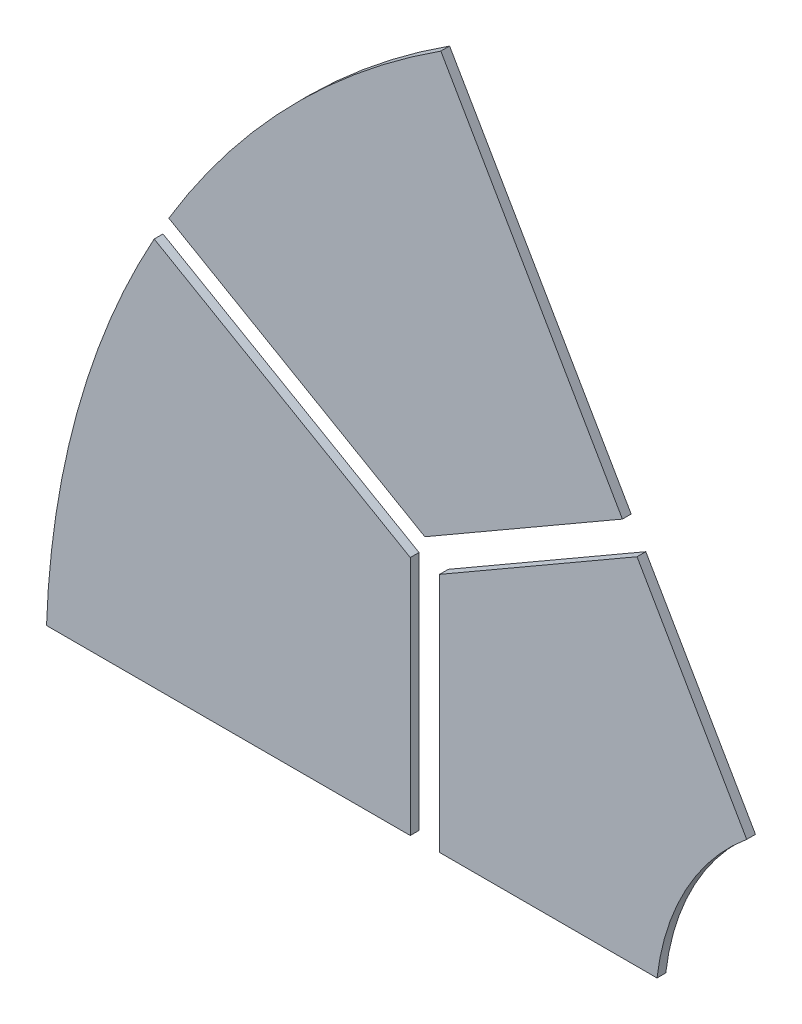
ISO-10303-21;
HEADER;
FILE_DESCRIPTION(('STEP AP214'),'2;1');
FILE_NAME('part.step','',(''),(''),'','','');
FILE_SCHEMA(('AUTOMOTIVE_DESIGN { 1 0 10303 214 1 1 1 1 }'));
ENDSEC;
DATA;
#1=APPLICATION_CONTEXT('core data for automotive mechanical design processes');
#2=APPLICATION_PROTOCOL_DEFINITION('international standard','automotive_design',2000,#1);
#3=PRODUCT_CONTEXT('',#1,'mechanical');
#4=PRODUCT('Part','Part','',(#3));
#5=PRODUCT_RELATED_PRODUCT_CATEGORY('part','',(#4));
#6=PRODUCT_DEFINITION_FORMATION('','',#4);
#7=PRODUCT_DEFINITION_CONTEXT('part definition',#1,'design');
#8=PRODUCT_DEFINITION('design','',#6,#7);
#9=PRODUCT_DEFINITION_SHAPE('','',#8);
#10=(LENGTH_UNIT() NAMED_UNIT(*) SI_UNIT(.MILLI.,.METRE.));
#11=(NAMED_UNIT(*) PLANE_ANGLE_UNIT() SI_UNIT($,.RADIAN.));
#12=(NAMED_UNIT(*) SI_UNIT($,.STERADIAN.) SOLID_ANGLE_UNIT());
#13=UNCERTAINTY_MEASURE_WITH_UNIT(LENGTH_MEASURE(1.E-05),#10,'distance_accuracy_value','');
#14=(GEOMETRIC_REPRESENTATION_CONTEXT(3) GLOBAL_UNCERTAINTY_ASSIGNED_CONTEXT((#13)) GLOBAL_UNIT_ASSIGNED_CONTEXT((#10,
#11,#12)) REPRESENTATION_CONTEXT('',''));
#15=CARTESIAN_POINT('',(0.,0.,0.));
#16=DIRECTION('',(0.,0.,1.));
#17=DIRECTION('',(1.,0.,0.));
#18=AXIS2_PLACEMENT_3D('',#15,#16,#17);
#19=CARTESIAN_POINT('',(0.,0.,6.));
#20=DIRECTION('',(0.,0.,-1.));
#21=DIRECTION('',(-1.,0.,0.));
#22=AXIS2_PLACEMENT_3D('',#19,#20,#21);
#23=CYLINDRICAL_SURFACE('',#22,172.4);
#24=CARTESIAN_POINT('',(0.,0.,0.));
#25=DIRECTION('',(0.,0.,1.));
#26=DIRECTION('',(1.,0.,0.));
#27=AXIS2_PLACEMENT_3D('',#24,#25,#26);
#28=CIRCLE('',#27,172.4);
#29=CARTESIAN_POINT('',(-109.821022542494,132.895082707078,0.));
#30=VERTEX_POINT('',#29);
#31=CARTESIAN_POINT('',(-171.235977528088,20.,0.));
#32=VERTEX_POINT('',#31);
#33=EDGE_CURVE('E174',#30,#32,#28,.T.);
#34=ORIENTED_EDGE('',*,*,#33,.F.);
#35=DIRECTION('',(0.,0.,-1.));
#36=VECTOR('',#35,1.);
#37=CARTESIAN_POINT('',(-109.821022542494,132.895082707078,6.));
#38=LINE('',#37,#36);
#39=CARTESIAN_POINT('',(-109.821022542494,132.895082707078,6.));
#40=VERTEX_POINT('',#39);
#41=EDGE_CURVE('E13',#40,#30,#38,.T.);
#42=ORIENTED_EDGE('',*,*,#41,.F.);
#43=CARTESIAN_POINT('',(0.,0.,6.));
#44=DIRECTION('',(0.,0.,1.));
#45=DIRECTION('',(1.,0.,0.));
#46=AXIS2_PLACEMENT_3D('',#43,#44,#45);
#47=CIRCLE('',#46,172.4);
#48=CARTESIAN_POINT('',(-171.235977528088,20.,6.));
#49=VERTEX_POINT('',#48);
#50=EDGE_CURVE('E185',#40,#49,#47,.T.);
#51=ORIENTED_EDGE('',*,*,#50,.T.);
#52=DIRECTION('',(0.,0.,-1.));
#53=VECTOR('',#52,1.);
#54=CARTESIAN_POINT('',(-171.235977528088,20.,6.));
#55=LINE('',#54,#53);
#56=EDGE_CURVE('E117',#49,#32,#55,.T.);
#57=ORIENTED_EDGE('',*,*,#56,.T.);
#58=EDGE_LOOP('',(#34,#42,#51,#57));
#59=FACE_BOUND('',#58,.T.);
#60=ADVANCED_FACE('F101',(#59),#23,.F.);
#61=CARTESIAN_POINT('',(-24.8205080756886,-14.3301270189221,6.));
#62=DIRECTION('',(-0.866025403784438,-0.5,0.));
#63=DIRECTION('',(0.5,-0.866025403784439,0.));
#64=AXIS2_PLACEMENT_3D('',#61,#62,#63);
#65=PLANE('',#64);
#66=DIRECTION('',(-0.5,0.866025403784439,0.));
#67=VECTOR('',#66,1.);
#68=CARTESIAN_POINT('',(-24.8205080756886,-14.3301270189221,0.));
#69=LINE('',#68,#67);
#70=CARTESIAN_POINT('',(-184.920508075688,262.971207272854,0.));
#71=VERTEX_POINT('',#70);
#72=EDGE_CURVE('E176',#30,#71,#69,.T.);
#73=ORIENTED_EDGE('',*,*,#72,.T.);
#74=DIRECTION('',(0.,0.,-1.));
#75=VECTOR('',#74,1.);
#76=CARTESIAN_POINT('',(-184.920508075688,262.971207272854,6.));
#77=LINE('',#76,#75);
#78=CARTESIAN_POINT('',(-184.920508075688,262.971207272854,6.));
#79=VERTEX_POINT('',#78);
#80=EDGE_CURVE('E109',#79,#71,#77,.T.);
#81=ORIENTED_EDGE('',*,*,#80,.F.);
#82=DIRECTION('',(-0.5,0.866025403784439,0.));
#83=VECTOR('',#82,1.);
#84=CARTESIAN_POINT('',(-24.8205080756886,-14.3301270189221,6.));
#85=LINE('',#84,#83);
#86=EDGE_CURVE('E165',#40,#79,#85,.T.);
#87=ORIENTED_EDGE('',*,*,#86,.F.);
#88=ORIENTED_EDGE('',*,*,#41,.T.);
#89=EDGE_LOOP('',(#73,#81,#87,#88));
#90=FACE_BOUND('',#89,.T.);
#91=ADVANCED_FACE('F189',(#90),#65,.F.);
#92=CARTESIAN_POINT('',(-160.099999999998,277.301334291777,6.));
#93=DIRECTION('',(-0.499999999999997,0.866025403784441,0.));
#94=DIRECTION('',(-0.866025403784441,-0.499999999999997,0.));
#95=AXIS2_PLACEMENT_3D('',#92,#93,#94);
#96=PLANE('',#95);
#97=DIRECTION('',(0.866025403784441,0.499999999999997,0.));
#98=VECTOR('',#97,1.);
#99=CARTESIAN_POINT('',(-160.099999999998,277.301334291777,0.));
#100=LINE('',#99,#98);
#101=CARTESIAN_POINT('',(-320.199999999999,184.867556194525,0.));
#102=VERTEX_POINT('',#101);
#103=EDGE_CURVE('E154',#102,#71,#100,.T.);
#104=ORIENTED_EDGE('',*,*,#103,.F.);
#105=DIRECTION('',(0.,0.,-1.));
#106=VECTOR('',#105,1.);
#107=CARTESIAN_POINT('',(-320.199999999999,184.867556194525,6.));
#108=LINE('',#107,#106);
#109=CARTESIAN_POINT('',(-320.199999999999,184.867556194525,6.));
#110=VERTEX_POINT('',#109);
#111=EDGE_CURVE('E149',#110,#102,#108,.T.);
#112=ORIENTED_EDGE('',*,*,#111,.F.);
#113=DIRECTION('',(0.866025403784441,0.499999999999997,0.));
#114=VECTOR('',#113,1.);
#115=CARTESIAN_POINT('',(-160.099999999998,277.301334291777,6.));
#116=LINE('',#115,#114);
#117=EDGE_CURVE('E152',#110,#79,#116,.T.);
#118=ORIENTED_EDGE('',*,*,#117,.T.);
#119=ORIENTED_EDGE('',*,*,#80,.T.);
#120=EDGE_LOOP('',(#104,#112,#118,#119));
#121=FACE_BOUND('',#120,.T.);
#122=ADVANCED_FACE('F151',(#121),#96,.T.);
#123=CARTESIAN_POINT('',(-320.199999999999,0.,6.));
#124=DIRECTION('',(-1.,0.,0.));
#125=DIRECTION('',(0.,0.,1.));
#126=AXIS2_PLACEMENT_3D('',#123,#124,#125);
#127=PLANE('',#126);
#128=DIRECTION('',(0.,1.,0.));
#129=VECTOR('',#128,1.);
#130=CARTESIAN_POINT('',(-320.199999999999,0.,0.));
#131=LINE('',#130,#129);
#132=CARTESIAN_POINT('',(-320.2,20.,0.));
#133=VERTEX_POINT('',#132);
#134=EDGE_CURVE('E180',#133,#102,#131,.T.);
#135=ORIENTED_EDGE('',*,*,#134,.F.);
#136=DIRECTION('',(0.,0.,-1.));
#137=VECTOR('',#136,1.);
#138=CARTESIAN_POINT('',(-320.2,20.,6.));
#139=LINE('',#138,#137);
#140=CARTESIAN_POINT('',(-320.2,20.,6.));
#141=VERTEX_POINT('',#140);
#142=EDGE_CURVE('E133',#141,#133,#139,.T.);
#143=ORIENTED_EDGE('',*,*,#142,.F.);
#144=DIRECTION('',(0.,1.,0.));
#145=VECTOR('',#144,1.);
#146=CARTESIAN_POINT('',(-320.199999999999,0.,6.));
#147=LINE('',#146,#145);
#148=EDGE_CURVE('E164',#141,#110,#147,.T.);
#149=ORIENTED_EDGE('',*,*,#148,.T.);
#150=ORIENTED_EDGE('',*,*,#111,.T.);
#151=EDGE_LOOP('',(#135,#143,#149,#150));
#152=FACE_BOUND('',#151,.T.);
#153=ADVANCED_FACE('F168',(#152),#127,.T.);
#154=CARTESIAN_POINT('',(0.,20.,6.));
#155=DIRECTION('',(0.,-1.,0.));
#156=DIRECTION('',(1.,0.,0.));
#157=AXIS2_PLACEMENT_3D('',#154,#155,#156);
#158=PLANE('',#157);
#159=DIRECTION('',(-1.,0.,0.));
#160=VECTOR('',#159,1.);
#161=CARTESIAN_POINT('',(0.,20.,0.));
#162=LINE('',#161,#160);
#163=EDGE_CURVE('E182',#32,#133,#162,.T.);
#164=ORIENTED_EDGE('',*,*,#163,.F.);
#165=ORIENTED_EDGE('',*,*,#56,.F.);
#166=DIRECTION('',(-1.,0.,0.));
#167=VECTOR('',#166,1.);
#168=CARTESIAN_POINT('',(0.,20.,6.));
#169=LINE('',#168,#167);
#170=EDGE_CURVE('E169',#49,#141,#169,.T.);
#171=ORIENTED_EDGE('',*,*,#170,.T.);
#172=ORIENTED_EDGE('',*,*,#142,.T.);
#173=EDGE_LOOP('',(#164,#165,#171,#172));
#174=FACE_BOUND('',#173,.T.);
#175=ADVANCED_FACE('F192',(#174),#158,.T.);
#176=CARTESIAN_POINT('',(0.,0.,6.));
#177=DIRECTION('',(0.,0.,1.));
#178=DIRECTION('',(1.,0.,0.));
#179=AXIS2_PLACEMENT_3D('',#176,#177,#178);
#180=PLANE('',#179);
#181=ORIENTED_EDGE('',*,*,#50,.F.);
#182=ORIENTED_EDGE('',*,*,#86,.T.);
#183=ORIENTED_EDGE('',*,*,#117,.F.);
#184=ORIENTED_EDGE('',*,*,#148,.F.);
#185=ORIENTED_EDGE('',*,*,#170,.F.);
#186=EDGE_LOOP('',(#181,#182,#183,#184,#185));
#187=FACE_BOUND('',#186,.T.);
#188=ADVANCED_FACE('F162',(#187),#180,.T.);
#189=CARTESIAN_POINT('',(0.,0.,0.));
#190=DIRECTION('',(0.,0.,1.));
#191=DIRECTION('',(1.,0.,0.));
#192=AXIS2_PLACEMENT_3D('',#189,#190,#191);
#193=PLANE('',#192);
#194=ORIENTED_EDGE('',*,*,#33,.T.);
#195=ORIENTED_EDGE('',*,*,#163,.T.);
#196=ORIENTED_EDGE('',*,*,#134,.T.);
#197=ORIENTED_EDGE('',*,*,#103,.T.);
#198=ORIENTED_EDGE('',*,*,#72,.F.);
#199=EDGE_LOOP('',(#194,#195,#196,#197,#198));
#200=FACE_BOUND('',#199,.T.);
#201=ADVANCED_FACE('F191',(#200),#193,.F.);
#202=CLOSED_SHELL('',(#60,#91,#122,#153,#175,#188,#201));
#203=MANIFOLD_SOLID_BREP('B2',#202);
#204=CARTESIAN_POINT('',(1.11022302462516E-13,0.,6.));
#205=DIRECTION('',(0.,0.,-1.));
#206=DIRECTION('',(-1.,0.,0.));
#207=AXIS2_PLACEMENT_3D('',#204,#205,#206);
#208=CYLINDRICAL_SURFACE('',#207,589.6);
#209=CARTESIAN_POINT('',(1.11022302462516E-13,0.,0.));
#210=DIRECTION('',(0.,0.,1.));
#211=DIRECTION('',(1.,0.,0.));
#212=AXIS2_PLACEMENT_3D('',#209,#210,#211);
#213=CIRCLE('',#212,589.6);
#214=CARTESIAN_POINT('',(-505.535131014502,303.417849359839,0.));
#215=VERTEX_POINT('',#214);
#216=CARTESIAN_POINT('',(-319.272010805122,495.674836073463,0.));
#217=VERTEX_POINT('',#216);
#218=EDGE_CURVE('E363',#215,#217,#213,.F.);
#219=ORIENTED_EDGE('',*,*,#218,.F.);
#220=DIRECTION('',(0.,0.,-1.));
#221=VECTOR('',#220,1.);
#222=CARTESIAN_POINT('',(-505.535131014502,303.417849359839,6.));
#223=LINE('',#222,#221);
#224=CARTESIAN_POINT('',(-505.535131014502,303.417849359839,6.));
#225=VERTEX_POINT('',#224);
#226=EDGE_CURVE('E99',#225,#215,#223,.T.);
#227=ORIENTED_EDGE('',*,*,#226,.F.);
#228=CARTESIAN_POINT('',(1.11022302462516E-13,0.,6.));
#229=DIRECTION('',(0.,0.,1.));
#230=DIRECTION('',(1.,0.,0.));
#231=AXIS2_PLACEMENT_3D('',#228,#229,#230);
#232=CIRCLE('',#231,589.6);
#233=CARTESIAN_POINT('',(-319.272010805122,495.674836073463,6.));
#234=VERTEX_POINT('',#233);
#235=EDGE_CURVE('E357',#225,#234,#232,.F.);
#236=ORIENTED_EDGE('',*,*,#235,.T.);
#237=DIRECTION('',(0.,0.,-1.));
#238=VECTOR('',#237,1.);
#239=CARTESIAN_POINT('',(-319.272010805122,495.674836073463,6.));
#240=LINE('',#239,#238);
#241=EDGE_CURVE('E338',#234,#217,#240,.T.);
#242=ORIENTED_EDGE('',*,*,#241,.T.);
#243=EDGE_LOOP('',(#219,#227,#236,#242));
#244=FACE_BOUND('',#243,.T.);
#245=ADVANCED_FACE('F300',(#244),#208,.T.);
#246=CARTESIAN_POINT('',(5.00000000000019,8.66025403784438,6.));
#247=DIRECTION('',(-0.500000000000014,-0.86602540378443,0.));
#248=DIRECTION('',(0.866025403784431,-0.500000000000014,0.));
#249=AXIS2_PLACEMENT_3D('',#246,#247,#248);
#250=PLANE('',#249);
#251=DIRECTION('',(-0.86602540378443,0.500000000000014,0.));
#252=VECTOR('',#251,1.);
#253=CARTESIAN_POINT('',(5.00000000000019,8.66025403784438,0.));
#254=LINE('',#253,#252);
#255=CARTESIAN_POINT('',(-330.199999999993,202.18806427021,0.));
#256=VERTEX_POINT('',#255);
#257=EDGE_CURVE('E351',#256,#215,#254,.T.);
#258=ORIENTED_EDGE('',*,*,#257,.F.);
#259=DIRECTION('',(0.,0.,-1.));
#260=VECTOR('',#259,1.);
#261=CARTESIAN_POINT('',(-330.199999999993,202.18806427021,6.));
#262=LINE('',#261,#260);
#263=CARTESIAN_POINT('',(-330.199999999993,202.18806427021,6.));
#264=VERTEX_POINT('',#263);
#265=EDGE_CURVE('E308',#264,#256,#262,.T.);
#266=ORIENTED_EDGE('',*,*,#265,.F.);
#267=DIRECTION('',(-0.86602540378443,0.500000000000014,0.));
#268=VECTOR('',#267,1.);
#269=CARTESIAN_POINT('',(5.00000000000019,8.66025403784438,6.));
#270=LINE('',#269,#268);
#271=EDGE_CURVE('E349',#264,#225,#270,.T.);
#272=ORIENTED_EDGE('',*,*,#271,.T.);
#273=ORIENTED_EDGE('',*,*,#226,.T.);
#274=EDGE_LOOP('',(#258,#266,#272,#273));
#275=FACE_BOUND('',#274,.T.);
#276=ADVANCED_FACE('F347',(#275),#250,.T.);
#277=CARTESIAN_POINT('',(-170.099999999998,294.621842367465,6.));
#278=DIRECTION('',(-0.499999999999997,0.86602540378444,0.));
#279=DIRECTION('',(-0.86602540378444,-0.499999999999998,0.));
#280=AXIS2_PLACEMENT_3D('',#277,#278,#279);
#281=PLANE('',#280);
#282=DIRECTION('',(0.86602540378444,0.499999999999997,0.));
#283=VECTOR('',#282,1.);
#284=CARTESIAN_POINT('',(-170.099999999998,294.621842367465,0.));
#285=LINE('',#284,#283);
#286=CARTESIAN_POINT('',(-194.920508075688,280.291715348543,0.));
#287=VERTEX_POINT('',#286);
#288=EDGE_CURVE('E331',#256,#287,#285,.T.);
#289=ORIENTED_EDGE('',*,*,#288,.T.);
#290=DIRECTION('',(0.,0.,-1.));
#291=VECTOR('',#290,1.);
#292=CARTESIAN_POINT('',(-194.920508075688,280.291715348543,6.));
#293=LINE('',#292,#291);
#294=CARTESIAN_POINT('',(-194.920508075688,280.291715348543,6.));
#295=VERTEX_POINT('',#294);
#296=EDGE_CURVE('E352',#295,#287,#293,.T.);
#297=ORIENTED_EDGE('',*,*,#296,.F.);
#298=DIRECTION('',(0.86602540378444,0.499999999999997,0.));
#299=VECTOR('',#298,1.);
#300=CARTESIAN_POINT('',(-170.099999999998,294.621842367465,6.));
#301=LINE('',#300,#299);
#302=EDGE_CURVE('E353',#264,#295,#301,.T.);
#303=ORIENTED_EDGE('',*,*,#302,.F.);
#304=ORIENTED_EDGE('',*,*,#265,.T.);
#305=EDGE_LOOP('',(#289,#297,#303,#304));
#306=FACE_BOUND('',#305,.T.);
#307=ADVANCED_FACE('F354',(#306),#281,.F.);
#308=CARTESIAN_POINT('',(-24.8205080756886,-14.3301270189221,6.));
#309=DIRECTION('',(-0.866025403784439,-0.5,0.));
#310=DIRECTION('',(0.5,-0.866025403784439,0.));
#311=AXIS2_PLACEMENT_3D('',#308,#309,#310);
#312=PLANE('',#311);
#313=DIRECTION('',(-0.5,0.866025403784439,0.));
#314=VECTOR('',#313,1.);
#315=CARTESIAN_POINT('',(-24.8205080756886,-14.3301270189221,0.));
#316=LINE('',#315,#314);
#317=EDGE_CURVE('E359',#287,#217,#316,.T.);
#318=ORIENTED_EDGE('',*,*,#317,.T.);
#319=ORIENTED_EDGE('',*,*,#241,.F.);
#320=DIRECTION('',(-0.5,0.866025403784439,0.));
#321=VECTOR('',#320,1.);
#322=CARTESIAN_POINT('',(-24.8205080756886,-14.3301270189221,6.));
#323=LINE('',#322,#321);
#324=EDGE_CURVE('E316',#295,#234,#323,.T.);
#325=ORIENTED_EDGE('',*,*,#324,.F.);
#326=ORIENTED_EDGE('',*,*,#296,.T.);
#327=EDGE_LOOP('',(#318,#319,#325,#326));
#328=FACE_BOUND('',#327,.T.);
#329=ADVANCED_FACE('F372',(#328),#312,.F.);
#330=CARTESIAN_POINT('',(0.,0.,6.));
#331=DIRECTION('',(0.,0.,1.));
#332=DIRECTION('',(1.,0.,0.));
#333=AXIS2_PLACEMENT_3D('',#330,#331,#332);
#334=PLANE('',#333);
#335=ORIENTED_EDGE('',*,*,#235,.F.);
#336=ORIENTED_EDGE('',*,*,#271,.F.);
#337=ORIENTED_EDGE('',*,*,#302,.T.);
#338=ORIENTED_EDGE('',*,*,#324,.T.);
#339=EDGE_LOOP('',(#335,#336,#337,#338));
#340=FACE_BOUND('',#339,.T.);
#341=ADVANCED_FACE('F356',(#340),#334,.T.);
#342=CARTESIAN_POINT('',(0.,0.,0.));
#343=DIRECTION('',(0.,0.,1.));
#344=DIRECTION('',(1.,0.,0.));
#345=AXIS2_PLACEMENT_3D('',#342,#343,#344);
#346=PLANE('',#345);
#347=ORIENTED_EDGE('',*,*,#218,.T.);
#348=ORIENTED_EDGE('',*,*,#317,.F.);
#349=ORIENTED_EDGE('',*,*,#288,.F.);
#350=ORIENTED_EDGE('',*,*,#257,.T.);
#351=EDGE_LOOP('',(#347,#348,#349,#350));
#352=FACE_BOUND('',#351,.T.);
#353=ADVANCED_FACE('F374',(#352),#346,.F.);
#354=CLOSED_SHELL('',(#245,#276,#307,#329,#341,#353));
#355=MANIFOLD_SOLID_BREP('B7',#354);
#356=CARTESIAN_POINT('',(1.11022302462516E-13,0.,6.));
#357=DIRECTION('',(0.,0.,-1.));
#358=DIRECTION('',(-1.,0.,0.));
#359=AXIS2_PLACEMENT_3D('',#356,#357,#358);
#360=CYLINDRICAL_SURFACE('',#359,589.6);
#361=CARTESIAN_POINT('',(1.11022302462516E-13,0.,0.));
#362=DIRECTION('',(0.,0.,1.));
#363=DIRECTION('',(1.,0.,0.));
#364=AXIS2_PLACEMENT_3D('',#361,#362,#363);
#365=CIRCLE('',#364,589.6);
#366=CARTESIAN_POINT('',(-589.260689338768,20.,0.));
#367=VERTEX_POINT('',#366);
#368=CARTESIAN_POINT('',(-515.535131014503,286.097341284151,0.));
#369=VERTEX_POINT('',#368);
#370=EDGE_CURVE('E511',#367,#369,#365,.F.);
#371=ORIENTED_EDGE('',*,*,#370,.F.);
#372=DIRECTION('',(0.,0.,-1.));
#373=VECTOR('',#372,1.);
#374=CARTESIAN_POINT('',(-589.260689338768,20.,6.));
#375=LINE('',#374,#373);
#376=CARTESIAN_POINT('',(-589.260689338768,20.,6.));
#377=VERTEX_POINT('',#376);
#378=EDGE_CURVE('E298',#377,#367,#375,.T.);
#379=ORIENTED_EDGE('',*,*,#378,.F.);
#380=CARTESIAN_POINT('',(1.11022302462516E-13,0.,6.));
#381=DIRECTION('',(0.,0.,1.));
#382=DIRECTION('',(1.,0.,0.));
#383=AXIS2_PLACEMENT_3D('',#380,#381,#382);
#384=CIRCLE('',#383,589.6);
#385=CARTESIAN_POINT('',(-515.535131014503,286.097341284151,6.));
#386=VERTEX_POINT('',#385);
#387=EDGE_CURVE('E505',#377,#386,#384,.F.);
#388=ORIENTED_EDGE('',*,*,#387,.T.);
#389=DIRECTION('',(0.,0.,-1.));
#390=VECTOR('',#389,1.);
#391=CARTESIAN_POINT('',(-515.535131014503,286.097341284151,6.));
#392=LINE('',#391,#390);
#393=EDGE_CURVE('E486',#386,#369,#392,.T.);
#394=ORIENTED_EDGE('',*,*,#393,.T.);
#395=EDGE_LOOP('',(#371,#379,#388,#394));
#396=FACE_BOUND('',#395,.T.);
#397=ADVANCED_FACE('F448',(#396),#360,.T.);
#398=CARTESIAN_POINT('',(0.,20.,6.));
#399=DIRECTION('',(0.,-1.,0.));
#400=DIRECTION('',(0.,0.,-1.));
#401=AXIS2_PLACEMENT_3D('',#398,#399,#400);
#402=PLANE('',#401);
#403=DIRECTION('',(-1.,0.,0.));
#404=VECTOR('',#403,1.);
#405=CARTESIAN_POINT('',(0.,20.,0.));
#406=LINE('',#405,#404);
#407=CARTESIAN_POINT('',(-340.2,20.,0.));
#408=VERTEX_POINT('',#407);
#409=EDGE_CURVE('E499',#408,#367,#406,.T.);
#410=ORIENTED_EDGE('',*,*,#409,.F.);
#411=DIRECTION('',(0.,0.,-1.));
#412=VECTOR('',#411,1.);
#413=CARTESIAN_POINT('',(-340.2,20.,6.));
#414=LINE('',#413,#412);
#415=CARTESIAN_POINT('',(-340.2,20.,6.));
#416=VERTEX_POINT('',#415);
#417=EDGE_CURVE('E456',#416,#408,#414,.T.);
#418=ORIENTED_EDGE('',*,*,#417,.F.);
#419=DIRECTION('',(-1.,0.,0.));
#420=VECTOR('',#419,1.);
#421=CARTESIAN_POINT('',(0.,20.,6.));
#422=LINE('',#421,#420);
#423=EDGE_CURVE('E497',#416,#377,#422,.T.);
#424=ORIENTED_EDGE('',*,*,#423,.T.);
#425=ORIENTED_EDGE('',*,*,#378,.T.);
#426=EDGE_LOOP('',(#410,#418,#424,#425));
#427=FACE_BOUND('',#426,.T.);
#428=ADVANCED_FACE('F495',(#427),#402,.T.);
#429=CARTESIAN_POINT('',(-340.2,1.14545845676222E-12,6.));
#430=DIRECTION('',(-1.,0.,0.));
#431=DIRECTION('',(0.,-1.,0.));
#432=AXIS2_PLACEMENT_3D('',#429,#430,#431);
#433=PLANE('',#432);
#434=DIRECTION('',(0.,1.,0.));
#435=VECTOR('',#434,1.);
#436=CARTESIAN_POINT('',(-340.2,1.14545845676222E-12,0.));
#437=LINE('',#436,#435);
#438=CARTESIAN_POINT('',(-340.199999999999,184.867556194525,0.));
#439=VERTEX_POINT('',#438);
#440=EDGE_CURVE('E479',#408,#439,#437,.T.);
#441=ORIENTED_EDGE('',*,*,#440,.T.);
#442=DIRECTION('',(0.,0.,-1.));
#443=VECTOR('',#442,1.);
#444=CARTESIAN_POINT('',(-340.199999999999,184.867556194525,6.));
#445=LINE('',#444,#443);
#446=CARTESIAN_POINT('',(-340.199999999999,184.867556194525,6.));
#447=VERTEX_POINT('',#446);
#448=EDGE_CURVE('E500',#447,#439,#445,.T.);
#449=ORIENTED_EDGE('',*,*,#448,.F.);
#450=DIRECTION('',(0.,1.,0.));
#451=VECTOR('',#450,1.);
#452=CARTESIAN_POINT('',(-340.2,1.14545845676222E-12,6.));
#453=LINE('',#452,#451);
#454=EDGE_CURVE('E501',#416,#447,#453,.T.);
#455=ORIENTED_EDGE('',*,*,#454,.F.);
#456=ORIENTED_EDGE('',*,*,#417,.T.);
#457=EDGE_LOOP('',(#441,#449,#455,#456));
#458=FACE_BOUND('',#457,.T.);
#459=ADVANCED_FACE('F502',(#458),#433,.F.);
#460=CARTESIAN_POINT('',(-5.00000000000011,-8.66025403784424,6.));
#461=DIRECTION('',(-0.500000000000014,-0.86602540378443,0.));
#462=DIRECTION('',(0.86602540378443,-0.500000000000014,0.));
#463=AXIS2_PLACEMENT_3D('',#460,#461,#462);
#464=PLANE('',#463);
#465=DIRECTION('',(-0.86602540378443,0.500000000000014,0.));
#466=VECTOR('',#465,1.);
#467=CARTESIAN_POINT('',(-5.00000000000011,-8.66025403784424,0.));
#468=LINE('',#467,#466);
#469=EDGE_CURVE('E507',#439,#369,#468,.T.);
#470=ORIENTED_EDGE('',*,*,#469,.T.);
#471=ORIENTED_EDGE('',*,*,#393,.F.);
#472=DIRECTION('',(-0.86602540378443,0.500000000000014,0.));
#473=VECTOR('',#472,1.);
#474=CARTESIAN_POINT('',(-5.00000000000011,-8.66025403784424,6.));
#475=LINE('',#474,#473);
#476=EDGE_CURVE('E464',#447,#386,#475,.T.);
#477=ORIENTED_EDGE('',*,*,#476,.F.);
#478=ORIENTED_EDGE('',*,*,#448,.T.);
#479=EDGE_LOOP('',(#470,#471,#477,#478));
#480=FACE_BOUND('',#479,.T.);
#481=ADVANCED_FACE('F520',(#480),#464,.F.);
#482=CARTESIAN_POINT('',(0.,0.,6.));
#483=DIRECTION('',(0.,0.,1.));
#484=DIRECTION('',(1.,0.,0.));
#485=AXIS2_PLACEMENT_3D('',#482,#483,#484);
#486=PLANE('',#485);
#487=ORIENTED_EDGE('',*,*,#387,.F.);
#488=ORIENTED_EDGE('',*,*,#423,.F.);
#489=ORIENTED_EDGE('',*,*,#454,.T.);
#490=ORIENTED_EDGE('',*,*,#476,.T.);
#491=EDGE_LOOP('',(#487,#488,#489,#490));
#492=FACE_BOUND('',#491,.T.);
#493=ADVANCED_FACE('F504',(#492),#486,.T.);
#494=CARTESIAN_POINT('',(0.,0.,0.));
#495=DIRECTION('',(0.,0.,1.));
#496=DIRECTION('',(1.,0.,0.));
#497=AXIS2_PLACEMENT_3D('',#494,#495,#496);
#498=PLANE('',#497);
#499=ORIENTED_EDGE('',*,*,#370,.T.);
#500=ORIENTED_EDGE('',*,*,#469,.F.);
#501=ORIENTED_EDGE('',*,*,#440,.F.);
#502=ORIENTED_EDGE('',*,*,#409,.T.);
#503=EDGE_LOOP('',(#499,#500,#501,#502));
#504=FACE_BOUND('',#503,.T.);
#505=ADVANCED_FACE('F522',(#504),#498,.F.);
#506=CLOSED_SHELL('',(#397,#428,#459,#481,#493,#505));
#507=MANIFOLD_SOLID_BREP('B93',#506);
#508=ADVANCED_BREP_SHAPE_REPRESENTATION('',(#18,#203,#355,#507),#14);
#509=SHAPE_DEFINITION_REPRESENTATION(#9,#508);
ENDSEC;
END-ISO-10303-21;
